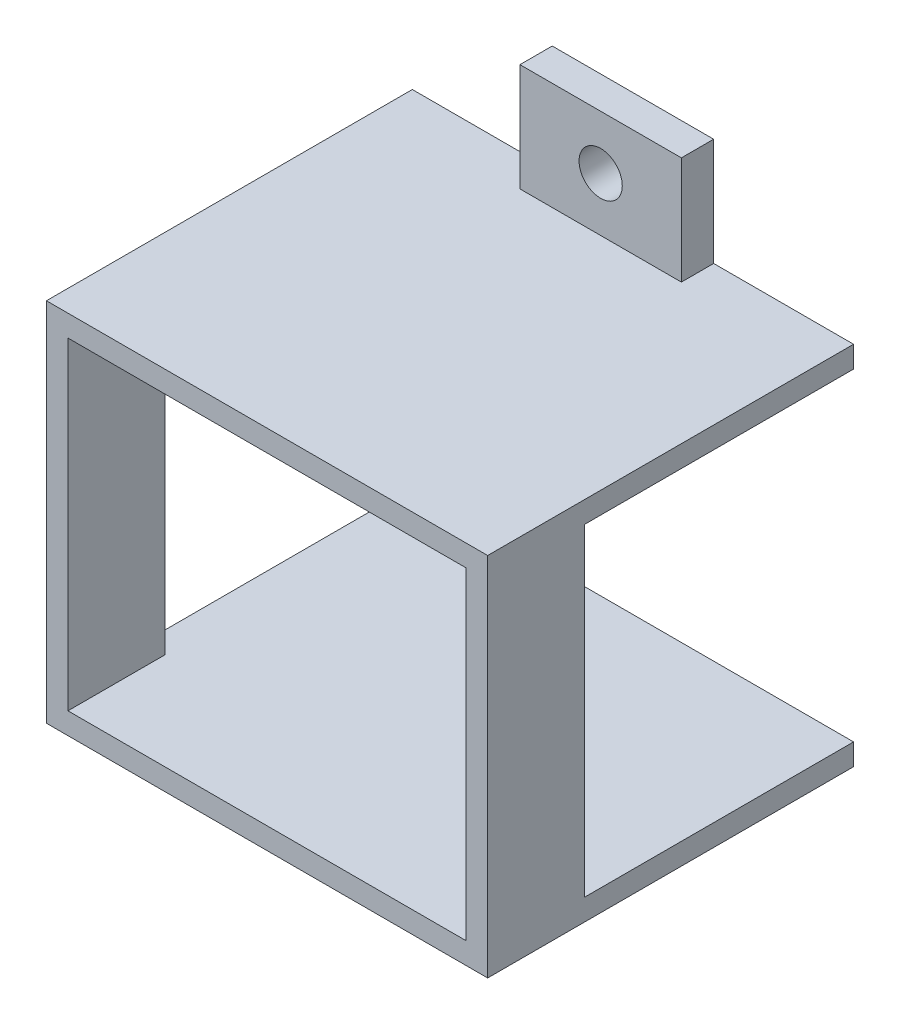
ISO-10303-21;
HEADER;
FILE_DESCRIPTION(('STEP AP214'),'2;1');
FILE_NAME('part.step','',(''),(''),'','','');
FILE_SCHEMA(('AUTOMOTIVE_DESIGN { 1 0 10303 214 1 1 1 1 }'));
ENDSEC;
DATA;
#1=APPLICATION_CONTEXT('core data for automotive mechanical design processes');
#2=APPLICATION_PROTOCOL_DEFINITION('international standard','automotive_design',2000,#1);
#3=PRODUCT_CONTEXT('',#1,'mechanical');
#4=PRODUCT('Part','Part','',(#3));
#5=PRODUCT_RELATED_PRODUCT_CATEGORY('part','',(#4));
#6=PRODUCT_DEFINITION_FORMATION('','',#4);
#7=PRODUCT_DEFINITION_CONTEXT('part definition',#1,'design');
#8=PRODUCT_DEFINITION('design','',#6,#7);
#9=PRODUCT_DEFINITION_SHAPE('','',#8);
#10=(LENGTH_UNIT() NAMED_UNIT(*) SI_UNIT(.MILLI.,.METRE.));
#11=(NAMED_UNIT(*) PLANE_ANGLE_UNIT() SI_UNIT($,.RADIAN.));
#12=(NAMED_UNIT(*) SI_UNIT($,.STERADIAN.) SOLID_ANGLE_UNIT());
#13=UNCERTAINTY_MEASURE_WITH_UNIT(LENGTH_MEASURE(1.E-05),#10,'distance_accuracy_value','');
#14=(GEOMETRIC_REPRESENTATION_CONTEXT(3) GLOBAL_UNCERTAINTY_ASSIGNED_CONTEXT((#13)) GLOBAL_UNIT_ASSIGNED_CONTEXT((#10,
#11,#12)) REPRESENTATION_CONTEXT('',''));
#15=CARTESIAN_POINT('',(0.,0.,0.));
#16=DIRECTION('',(0.,0.,1.));
#17=DIRECTION('',(1.,0.,0.));
#18=AXIS2_PLACEMENT_3D('',#15,#16,#17);
#19=CARTESIAN_POINT('',(0.,0.,0.));
#20=DIRECTION('',(0.,0.,1.));
#21=DIRECTION('',(1.,0.,0.));
#22=AXIS2_PLACEMENT_3D('',#19,#20,#21);
#23=PLANE('',#22);
#24=CARTESIAN_POINT('',(0.,22.,0.));
#25=DIRECTION('',(0.,0.,1.));
#26=DIRECTION('',(1.,0.,0.));
#27=AXIS2_PLACEMENT_3D('',#24,#25,#26);
#28=CIRCLE('',#27,2.00806305532725);
#29=CARTESIAN_POINT('',(2.00806305532725,22.,0.));
#30=VERTEX_POINT('',#29);
#31=EDGE_CURVE('E288',#30,#30,#28,.T.);
#32=ORIENTED_EDGE('',*,*,#31,.T.);
#33=EDGE_LOOP('',(#32));
#34=FACE_BOUND('',#33,.T.);
#35=DIRECTION('',(0.,1.,0.));
#36=VECTOR('',#35,1.);
#37=CARTESIAN_POINT('',(20.5,17.,0.));
#38=LINE('',#37,#36);
#39=CARTESIAN_POINT('',(20.5,15.,0.));
#40=VERTEX_POINT('',#39);
#41=CARTESIAN_POINT('',(20.5,17.,0.));
#42=VERTEX_POINT('',#41);
#43=EDGE_CURVE('E227',#40,#42,#38,.T.);
#44=ORIENTED_EDGE('',*,*,#43,.F.);
#45=DIRECTION('',(-1.,0.,0.));
#46=VECTOR('',#45,1.);
#47=CARTESIAN_POINT('',(-18.5,15.,0.));
#48=LINE('',#47,#46);
#49=CARTESIAN_POINT('',(-20.5,15.,0.));
#50=VERTEX_POINT('',#49);
#51=EDGE_CURVE('E183',#40,#50,#48,.T.);
#52=ORIENTED_EDGE('',*,*,#51,.T.);
#53=DIRECTION('',(0.,-1.,0.));
#54=VECTOR('',#53,1.);
#55=CARTESIAN_POINT('',(-20.5,17.,0.));
#56=LINE('',#55,#54);
#57=CARTESIAN_POINT('',(-20.5,17.,0.));
#58=VERTEX_POINT('',#57);
#59=EDGE_CURVE('E199',#58,#50,#56,.T.);
#60=ORIENTED_EDGE('',*,*,#59,.F.);
#61=DIRECTION('',(-1.,0.,0.));
#62=VECTOR('',#61,1.);
#63=CARTESIAN_POINT('',(-20.5,17.,0.));
#64=LINE('',#63,#62);
#65=CARTESIAN_POINT('',(-7.5,17.,0.));
#66=VERTEX_POINT('',#65);
#67=EDGE_CURVE('E203',#66,#58,#64,.T.);
#68=ORIENTED_EDGE('',*,*,#67,.F.);
#69=DIRECTION('',(0.,-1.,0.));
#70=VECTOR('',#69,1.);
#71=CARTESIAN_POINT('',(-7.5,27.,0.));
#72=LINE('',#71,#70);
#73=CARTESIAN_POINT('',(-7.5,27.,0.));
#74=VERTEX_POINT('',#73);
#75=EDGE_CURVE('E302',#74,#66,#72,.T.);
#76=ORIENTED_EDGE('',*,*,#75,.F.);
#77=DIRECTION('',(-1.,0.,0.));
#78=VECTOR('',#77,1.);
#79=CARTESIAN_POINT('',(-7.5,27.,0.));
#80=LINE('',#79,#78);
#81=CARTESIAN_POINT('',(7.5,27.,0.));
#82=VERTEX_POINT('',#81);
#83=EDGE_CURVE('E300',#82,#74,#80,.T.);
#84=ORIENTED_EDGE('',*,*,#83,.F.);
#85=DIRECTION('',(0.,-1.,0.));
#86=VECTOR('',#85,1.);
#87=CARTESIAN_POINT('',(7.5,27.,0.));
#88=LINE('',#87,#86);
#89=CARTESIAN_POINT('',(7.5,17.,0.));
#90=VERTEX_POINT('',#89);
#91=EDGE_CURVE('E311',#82,#90,#88,.T.);
#92=ORIENTED_EDGE('',*,*,#91,.T.);
#93=EDGE_CURVE('E200',#42,#90,#64,.T.);
#94=ORIENTED_EDGE('',*,*,#93,.F.);
#95=EDGE_LOOP('',(#44,#52,#60,#68,#76,#84,#92,#94));
#96=FACE_BOUND('',#95,.T.);
#97=ADVANCED_FACE('F33',(#34,#96),#23,.F.);
#98=CARTESIAN_POINT('',(-20.5,17.,34.));
#99=DIRECTION('',(0.,-1.,0.));
#100=DIRECTION('',(0.,0.,-1.));
#101=AXIS2_PLACEMENT_3D('',#98,#99,#100);
#102=PLANE('',#101);
#103=DIRECTION('',(0.,0.,1.));
#104=VECTOR('',#103,1.);
#105=CARTESIAN_POINT('',(-7.5,17.,0.));
#106=LINE('',#105,#104);
#107=CARTESIAN_POINT('',(-7.5,17.,3.));
#108=VERTEX_POINT('',#107);
#109=EDGE_CURVE('E291',#66,#108,#106,.T.);
#110=ORIENTED_EDGE('',*,*,#109,.F.);
#111=ORIENTED_EDGE('',*,*,#67,.T.);
#112=DIRECTION('',(0.,0.,-1.));
#113=VECTOR('',#112,1.);
#114=CARTESIAN_POINT('',(-20.5,17.,34.));
#115=LINE('',#114,#113);
#116=CARTESIAN_POINT('',(-20.5,17.,34.));
#117=VERTEX_POINT('',#116);
#118=EDGE_CURVE('E41',#117,#58,#115,.T.);
#119=ORIENTED_EDGE('',*,*,#118,.F.);
#120=DIRECTION('',(-1.,0.,0.));
#121=VECTOR('',#120,1.);
#122=CARTESIAN_POINT('',(-20.5,17.,34.));
#123=LINE('',#122,#121);
#124=CARTESIAN_POINT('',(20.5,17.,34.));
#125=VERTEX_POINT('',#124);
#126=EDGE_CURVE('E339',#125,#117,#123,.T.);
#127=ORIENTED_EDGE('',*,*,#126,.F.);
#128=DIRECTION('',(0.,0.,-1.));
#129=VECTOR('',#128,1.);
#130=CARTESIAN_POINT('',(20.5,17.,34.));
#131=LINE('',#130,#129);
#132=EDGE_CURVE('E11',#125,#42,#131,.T.);
#133=ORIENTED_EDGE('',*,*,#132,.T.);
#134=ORIENTED_EDGE('',*,*,#93,.T.);
#135=DIRECTION('',(0.,0.,-1.));
#136=VECTOR('',#135,1.);
#137=CARTESIAN_POINT('',(7.5,17.,0.));
#138=LINE('',#137,#136);
#139=CARTESIAN_POINT('',(7.5,17.,3.));
#140=VERTEX_POINT('',#139);
#141=EDGE_CURVE('E296',#140,#90,#138,.T.);
#142=ORIENTED_EDGE('',*,*,#141,.F.);
#143=DIRECTION('',(1.,0.,0.));
#144=VECTOR('',#143,1.);
#145=CARTESIAN_POINT('',(-7.5,17.,3.));
#146=LINE('',#145,#144);
#147=EDGE_CURVE('E305',#108,#140,#146,.T.);
#148=ORIENTED_EDGE('',*,*,#147,.F.);
#149=EDGE_LOOP('',(#110,#111,#119,#127,#133,#134,#142,#148));
#150=FACE_BOUND('',#149,.T.);
#151=ADVANCED_FACE('F348',(#150),#102,.F.);
#152=CARTESIAN_POINT('',(0.,0.,34.));
#153=DIRECTION('',(0.,0.,1.));
#154=DIRECTION('',(1.,0.,0.));
#155=AXIS2_PLACEMENT_3D('',#152,#153,#154);
#156=PLANE('',#155);
#157=DIRECTION('',(0.,1.,0.));
#158=VECTOR('',#157,1.);
#159=CARTESIAN_POINT('',(20.5,17.,34.));
#160=LINE('',#159,#158);
#161=CARTESIAN_POINT('',(20.5,-17.,34.));
#162=VERTEX_POINT('',#161);
#163=EDGE_CURVE('E208',#162,#125,#160,.T.);
#164=ORIENTED_EDGE('',*,*,#163,.T.);
#165=ORIENTED_EDGE('',*,*,#126,.T.);
#166=DIRECTION('',(0.,-1.,0.));
#167=VECTOR('',#166,1.);
#168=CARTESIAN_POINT('',(-20.5,17.,34.));
#169=LINE('',#168,#167);
#170=CARTESIAN_POINT('',(-20.5,-17.,34.));
#171=VERTEX_POINT('',#170);
#172=EDGE_CURVE('E218',#117,#171,#169,.T.);
#173=ORIENTED_EDGE('',*,*,#172,.T.);
#174=DIRECTION('',(1.,0.,0.));
#175=VECTOR('',#174,1.);
#176=CARTESIAN_POINT('',(-20.5,-17.,34.));
#177=LINE('',#176,#175);
#178=EDGE_CURVE('E213',#171,#162,#177,.T.);
#179=ORIENTED_EDGE('',*,*,#178,.T.);
#180=EDGE_LOOP('',(#164,#165,#173,#179));
#181=FACE_BOUND('',#180,.T.);
#182=DIRECTION('',(-1.,0.,0.));
#183=VECTOR('',#182,1.);
#184=CARTESIAN_POINT('',(-18.5,15.,34.));
#185=LINE('',#184,#183);
#186=CARTESIAN_POINT('',(18.5,15.,34.));
#187=VERTEX_POINT('',#186);
#188=CARTESIAN_POINT('',(-18.5,15.,34.));
#189=VERTEX_POINT('',#188);
#190=EDGE_CURVE('E320',#187,#189,#185,.T.);
#191=ORIENTED_EDGE('',*,*,#190,.F.);
#192=DIRECTION('',(0.,1.,0.));
#193=VECTOR('',#192,1.);
#194=CARTESIAN_POINT('',(18.5,15.,34.));
#195=LINE('',#194,#193);
#196=CARTESIAN_POINT('',(18.5,-15.,34.));
#197=VERTEX_POINT('',#196);
#198=EDGE_CURVE('E182',#197,#187,#195,.T.);
#199=ORIENTED_EDGE('',*,*,#198,.F.);
#200=DIRECTION('',(1.,0.,0.));
#201=VECTOR('',#200,1.);
#202=CARTESIAN_POINT('',(-18.5,-15.,34.));
#203=LINE('',#202,#201);
#204=CARTESIAN_POINT('',(-18.5,-15.,34.));
#205=VERTEX_POINT('',#204);
#206=EDGE_CURVE('E325',#205,#197,#203,.T.);
#207=ORIENTED_EDGE('',*,*,#206,.F.);
#208=DIRECTION('',(0.,-1.,0.));
#209=VECTOR('',#208,1.);
#210=CARTESIAN_POINT('',(-18.5,15.,34.));
#211=LINE('',#210,#209);
#212=EDGE_CURVE('E322',#189,#205,#211,.T.);
#213=ORIENTED_EDGE('',*,*,#212,.F.);
#214=EDGE_LOOP('',(#191,#199,#207,#213));
#215=FACE_BOUND('',#214,.T.);
#216=ADVANCED_FACE('F350',(#181,#215),#156,.T.);
#217=CARTESIAN_POINT('',(0.,-22.,0.));
#218=DIRECTION('',(0.,0.,1.));
#219=DIRECTION('',(1.,0.,0.));
#220=AXIS2_PLACEMENT_3D('',#217,#218,#219);
#221=CIRCLE('',#220,2.00806305532725);
#222=CARTESIAN_POINT('',(2.00806305532725,-22.,0.));
#223=VERTEX_POINT('',#222);
#224=EDGE_CURVE('E256',#223,#223,#221,.F.);
#225=ORIENTED_EDGE('',*,*,#224,.F.);
#226=EDGE_LOOP('',(#225));
#227=FACE_BOUND('',#226,.T.);
#228=CARTESIAN_POINT('',(-20.5,-15.,0.));
#229=VERTEX_POINT('',#228);
#230=CARTESIAN_POINT('',(-20.5,-17.,0.));
#231=VERTEX_POINT('',#230);
#232=EDGE_CURVE('E189',#229,#231,#56,.T.);
#233=ORIENTED_EDGE('',*,*,#232,.F.);
#234=DIRECTION('',(1.,0.,0.));
#235=VECTOR('',#234,1.);
#236=CARTESIAN_POINT('',(-18.5,-15.,0.));
#237=LINE('',#236,#235);
#238=CARTESIAN_POINT('',(20.5,-15.,0.));
#239=VERTEX_POINT('',#238);
#240=EDGE_CURVE('E169',#229,#239,#237,.T.);
#241=ORIENTED_EDGE('',*,*,#240,.T.);
#242=CARTESIAN_POINT('',(20.5,-17.,0.));
#243=VERTEX_POINT('',#242);
#244=EDGE_CURVE('E342',#243,#239,#38,.T.);
#245=ORIENTED_EDGE('',*,*,#244,.F.);
#246=DIRECTION('',(1.,0.,0.));
#247=VECTOR('',#246,1.);
#248=CARTESIAN_POINT('',(-20.5,-17.,0.));
#249=LINE('',#248,#247);
#250=CARTESIAN_POINT('',(7.5,-17.,0.));
#251=VERTEX_POINT('',#250);
#252=EDGE_CURVE('E202',#251,#243,#249,.T.);
#253=ORIENTED_EDGE('',*,*,#252,.F.);
#254=DIRECTION('',(0.,1.,0.));
#255=VECTOR('',#254,1.);
#256=CARTESIAN_POINT('',(7.5,-27.,0.));
#257=LINE('',#256,#255);
#258=CARTESIAN_POINT('',(7.5,-27.,0.));
#259=VERTEX_POINT('',#258);
#260=EDGE_CURVE('E56',#259,#251,#257,.T.);
#261=ORIENTED_EDGE('',*,*,#260,.F.);
#262=DIRECTION('',(-1.,0.,0.));
#263=VECTOR('',#262,1.);
#264=CARTESIAN_POINT('',(-7.5,-27.,0.));
#265=LINE('',#264,#263);
#266=CARTESIAN_POINT('',(-7.5,-27.,0.));
#267=VERTEX_POINT('',#266);
#268=EDGE_CURVE('E263',#259,#267,#265,.T.);
#269=ORIENTED_EDGE('',*,*,#268,.T.);
#270=DIRECTION('',(0.,1.,0.));
#271=VECTOR('',#270,1.);
#272=CARTESIAN_POINT('',(-7.5,-27.,0.));
#273=LINE('',#272,#271);
#274=CARTESIAN_POINT('',(-7.5,-17.,0.));
#275=VERTEX_POINT('',#274);
#276=EDGE_CURVE('E283',#267,#275,#273,.T.);
#277=ORIENTED_EDGE('',*,*,#276,.T.);
#278=EDGE_CURVE('E198',#231,#275,#249,.T.);
#279=ORIENTED_EDGE('',*,*,#278,.F.);
#280=EDGE_LOOP('',(#233,#241,#245,#253,#261,#269,#277,#279));
#281=FACE_BOUND('',#280,.T.);
#282=ADVANCED_FACE('F196',(#227,#281),#23,.F.);
#283=CARTESIAN_POINT('',(20.5,17.,34.));
#284=DIRECTION('',(-1.,0.,0.));
#285=DIRECTION('',(0.,0.,1.));
#286=AXIS2_PLACEMENT_3D('',#283,#284,#285);
#287=PLANE('',#286);
#288=DIRECTION('',(0.,1.,0.));
#289=VECTOR('',#288,1.);
#290=CARTESIAN_POINT('',(20.5,17.,25.));
#291=LINE('',#290,#289);
#292=CARTESIAN_POINT('',(20.5,-15.,25.));
#293=VERTEX_POINT('',#292);
#294=CARTESIAN_POINT('',(20.5,15.,25.));
#295=VERTEX_POINT('',#294);
#296=EDGE_CURVE('E247',#293,#295,#291,.T.);
#297=ORIENTED_EDGE('',*,*,#296,.T.);
#298=DIRECTION('',(0.,0.,-1.));
#299=VECTOR('',#298,1.);
#300=CARTESIAN_POINT('',(20.5,15.,34.));
#301=LINE('',#300,#299);
#302=EDGE_CURVE('E251',#295,#40,#301,.T.);
#303=ORIENTED_EDGE('',*,*,#302,.T.);
#304=ORIENTED_EDGE('',*,*,#43,.T.);
#305=ORIENTED_EDGE('',*,*,#132,.F.);
#306=ORIENTED_EDGE('',*,*,#163,.F.);
#307=DIRECTION('',(0.,0.,-1.));
#308=VECTOR('',#307,1.);
#309=CARTESIAN_POINT('',(20.5,-17.,34.));
#310=LINE('',#309,#308);
#311=EDGE_CURVE('E209',#162,#243,#310,.T.);
#312=ORIENTED_EDGE('',*,*,#311,.T.);
#313=ORIENTED_EDGE('',*,*,#244,.T.);
#314=DIRECTION('',(0.,0.,1.));
#315=VECTOR('',#314,1.);
#316=CARTESIAN_POINT('',(20.5,-15.,34.));
#317=LINE('',#316,#315);
#318=EDGE_CURVE('E177',#239,#293,#317,.T.);
#319=ORIENTED_EDGE('',*,*,#318,.T.);
#320=EDGE_LOOP('',(#297,#303,#304,#305,#306,#312,#313,#319));
#321=FACE_BOUND('',#320,.T.);
#322=ADVANCED_FACE('F35',(#321),#287,.F.);
#323=CARTESIAN_POINT('',(-20.5,17.,34.));
#324=DIRECTION('',(1.,0.,0.));
#325=DIRECTION('',(0.,1.,0.));
#326=AXIS2_PLACEMENT_3D('',#323,#324,#325);
#327=PLANE('',#326);
#328=ORIENTED_EDGE('',*,*,#59,.T.);
#329=DIRECTION('',(0.,0.,-1.));
#330=VECTOR('',#329,1.);
#331=CARTESIAN_POINT('',(-20.5,15.,0.));
#332=LINE('',#331,#330);
#333=CARTESIAN_POINT('',(-20.5,15.,25.));
#334=VERTEX_POINT('',#333);
#335=EDGE_CURVE('E232',#334,#50,#332,.T.);
#336=ORIENTED_EDGE('',*,*,#335,.F.);
#337=DIRECTION('',(0.,1.,0.));
#338=VECTOR('',#337,1.);
#339=CARTESIAN_POINT('',(-20.5,-15.,25.));
#340=LINE('',#339,#338);
#341=CARTESIAN_POINT('',(-20.5,-15.,25.));
#342=VERTEX_POINT('',#341);
#343=EDGE_CURVE('E193',#342,#334,#340,.T.);
#344=ORIENTED_EDGE('',*,*,#343,.F.);
#345=DIRECTION('',(0.,0.,1.));
#346=VECTOR('',#345,1.);
#347=CARTESIAN_POINT('',(-20.5,-15.,0.));
#348=LINE('',#347,#346);
#349=EDGE_CURVE('E173',#229,#342,#348,.T.);
#350=ORIENTED_EDGE('',*,*,#349,.F.);
#351=ORIENTED_EDGE('',*,*,#232,.T.);
#352=DIRECTION('',(0.,0.,-1.));
#353=VECTOR('',#352,1.);
#354=CARTESIAN_POINT('',(-20.5,-17.,34.));
#355=LINE('',#354,#353);
#356=EDGE_CURVE('E212',#171,#231,#355,.T.);
#357=ORIENTED_EDGE('',*,*,#356,.F.);
#358=ORIENTED_EDGE('',*,*,#172,.F.);
#359=ORIENTED_EDGE('',*,*,#118,.T.);
#360=EDGE_LOOP('',(#328,#336,#344,#350,#351,#357,#358,#359));
#361=FACE_BOUND('',#360,.T.);
#362=ADVANCED_FACE('F187',(#361),#327,.F.);
#363=CARTESIAN_POINT('',(-20.5,-17.,34.));
#364=DIRECTION('',(0.,1.,0.));
#365=DIRECTION('',(0.,0.,1.));
#366=AXIS2_PLACEMENT_3D('',#363,#364,#365);
#367=PLANE('',#366);
#368=ORIENTED_EDGE('',*,*,#278,.T.);
#369=DIRECTION('',(0.,0.,1.));
#370=VECTOR('',#369,1.);
#371=CARTESIAN_POINT('',(-7.5,-17.,0.));
#372=LINE('',#371,#370);
#373=CARTESIAN_POINT('',(-7.5,-17.,3.));
#374=VERTEX_POINT('',#373);
#375=EDGE_CURVE('E259',#275,#374,#372,.T.);
#376=ORIENTED_EDGE('',*,*,#375,.T.);
#377=DIRECTION('',(1.,0.,0.));
#378=VECTOR('',#377,1.);
#379=CARTESIAN_POINT('',(-7.5,-17.,3.));
#380=LINE('',#379,#378);
#381=CARTESIAN_POINT('',(7.5,-17.,3.));
#382=VERTEX_POINT('',#381);
#383=EDGE_CURVE('E264',#374,#382,#380,.T.);
#384=ORIENTED_EDGE('',*,*,#383,.T.);
#385=DIRECTION('',(0.,0.,-1.));
#386=VECTOR('',#385,1.);
#387=CARTESIAN_POINT('',(7.5,-17.,0.));
#388=LINE('',#387,#386);
#389=EDGE_CURVE('E275',#382,#251,#388,.T.);
#390=ORIENTED_EDGE('',*,*,#389,.T.);
#391=ORIENTED_EDGE('',*,*,#252,.T.);
#392=ORIENTED_EDGE('',*,*,#311,.F.);
#393=ORIENTED_EDGE('',*,*,#178,.F.);
#394=ORIENTED_EDGE('',*,*,#356,.T.);
#395=EDGE_LOOP('',(#368,#376,#384,#390,#391,#392,#393,#394));
#396=FACE_BOUND('',#395,.T.);
#397=ADVANCED_FACE('F357',(#396),#367,.F.);
#398=CARTESIAN_POINT('',(18.5,15.,34.));
#399=DIRECTION('',(-1.,0.,0.));
#400=DIRECTION('',(0.,-1.,0.));
#401=AXIS2_PLACEMENT_3D('',#398,#399,#400);
#402=PLANE('',#401);
#403=DIRECTION('',(0.,1.,0.));
#404=VECTOR('',#403,1.);
#405=CARTESIAN_POINT('',(18.5,15.,25.));
#406=LINE('',#405,#404);
#407=CARTESIAN_POINT('',(18.5,-15.,25.));
#408=VERTEX_POINT('',#407);
#409=CARTESIAN_POINT('',(18.5,15.,25.));
#410=VERTEX_POINT('',#409);
#411=EDGE_CURVE('E245',#408,#410,#406,.T.);
#412=ORIENTED_EDGE('',*,*,#411,.F.);
#413=DIRECTION('',(0.,0.,-1.));
#414=VECTOR('',#413,1.);
#415=CARTESIAN_POINT('',(18.5,-15.,34.));
#416=LINE('',#415,#414);
#417=EDGE_CURVE('E326',#197,#408,#416,.T.);
#418=ORIENTED_EDGE('',*,*,#417,.F.);
#419=ORIENTED_EDGE('',*,*,#198,.T.);
#420=DIRECTION('',(0.,0.,-1.));
#421=VECTOR('',#420,1.);
#422=CARTESIAN_POINT('',(18.5,15.,34.));
#423=LINE('',#422,#421);
#424=EDGE_CURVE('E334',#187,#410,#423,.T.);
#425=ORIENTED_EDGE('',*,*,#424,.T.);
#426=EDGE_LOOP('',(#412,#418,#419,#425));
#427=FACE_BOUND('',#426,.T.);
#428=ADVANCED_FACE('F462',(#427),#402,.T.);
#429=CARTESIAN_POINT('',(-18.5,15.,34.));
#430=DIRECTION('',(0.,-1.,0.));
#431=DIRECTION('',(0.,0.,-1.));
#432=AXIS2_PLACEMENT_3D('',#429,#430,#431);
#433=PLANE('',#432);
#434=DIRECTION('',(0.,0.,-1.));
#435=VECTOR('',#434,1.);
#436=CARTESIAN_POINT('',(-18.5,15.,34.));
#437=LINE('',#436,#435);
#438=CARTESIAN_POINT('',(-18.5,15.,25.));
#439=VERTEX_POINT('',#438);
#440=EDGE_CURVE('E332',#189,#439,#437,.T.);
#441=ORIENTED_EDGE('',*,*,#440,.T.);
#442=DIRECTION('',(-1.,0.,0.));
#443=VECTOR('',#442,1.);
#444=CARTESIAN_POINT('',(39.5,15.,25.));
#445=LINE('',#444,#443);
#446=EDGE_CURVE('E235',#439,#334,#445,.T.);
#447=ORIENTED_EDGE('',*,*,#446,.T.);
#448=ORIENTED_EDGE('',*,*,#335,.T.);
#449=ORIENTED_EDGE('',*,*,#51,.F.);
#450=ORIENTED_EDGE('',*,*,#302,.F.);
#451=EDGE_CURVE('E241',#295,#410,#445,.T.);
#452=ORIENTED_EDGE('',*,*,#451,.T.);
#453=ORIENTED_EDGE('',*,*,#424,.F.);
#454=ORIENTED_EDGE('',*,*,#190,.T.);
#455=EDGE_LOOP('',(#441,#447,#448,#449,#450,#452,#453,#454));
#456=FACE_BOUND('',#455,.T.);
#457=ADVANCED_FACE('F234',(#456),#433,.T.);
#458=CARTESIAN_POINT('',(-18.5,15.,34.));
#459=DIRECTION('',(1.,0.,0.));
#460=DIRECTION('',(0.,1.,0.));
#461=AXIS2_PLACEMENT_3D('',#458,#459,#460);
#462=PLANE('',#461);
#463=DIRECTION('',(0.,-1.,0.));
#464=VECTOR('',#463,1.);
#465=CARTESIAN_POINT('',(-18.5,15.,25.));
#466=LINE('',#465,#464);
#467=CARTESIAN_POINT('',(-18.5,-15.,25.));
#468=VERTEX_POINT('',#467);
#469=EDGE_CURVE('E243',#439,#468,#466,.T.);
#470=ORIENTED_EDGE('',*,*,#469,.F.);
#471=ORIENTED_EDGE('',*,*,#440,.F.);
#472=ORIENTED_EDGE('',*,*,#212,.T.);
#473=DIRECTION('',(0.,0.,-1.));
#474=VECTOR('',#473,1.);
#475=CARTESIAN_POINT('',(-18.5,-15.,34.));
#476=LINE('',#475,#474);
#477=EDGE_CURVE('E329',#205,#468,#476,.T.);
#478=ORIENTED_EDGE('',*,*,#477,.T.);
#479=EDGE_LOOP('',(#470,#471,#472,#478));
#480=FACE_BOUND('',#479,.T.);
#481=ADVANCED_FACE('F476',(#480),#462,.T.);
#482=CARTESIAN_POINT('',(-18.5,-15.,34.));
#483=DIRECTION('',(0.,1.,0.));
#484=DIRECTION('',(0.,0.,1.));
#485=AXIS2_PLACEMENT_3D('',#482,#483,#484);
#486=PLANE('',#485);
#487=ORIENTED_EDGE('',*,*,#417,.T.);
#488=DIRECTION('',(-1.,0.,0.));
#489=VECTOR('',#488,1.);
#490=CARTESIAN_POINT('',(39.5,-15.,25.));
#491=LINE('',#490,#489);
#492=EDGE_CURVE('E237',#293,#408,#491,.T.);
#493=ORIENTED_EDGE('',*,*,#492,.F.);
#494=ORIENTED_EDGE('',*,*,#318,.F.);
#495=ORIENTED_EDGE('',*,*,#240,.F.);
#496=ORIENTED_EDGE('',*,*,#349,.T.);
#497=EDGE_CURVE('E48',#468,#342,#491,.T.);
#498=ORIENTED_EDGE('',*,*,#497,.F.);
#499=ORIENTED_EDGE('',*,*,#477,.F.);
#500=ORIENTED_EDGE('',*,*,#206,.T.);
#501=EDGE_LOOP('',(#487,#493,#494,#495,#496,#498,#499,#500));
#502=FACE_BOUND('',#501,.T.);
#503=ADVANCED_FACE('F172',(#502),#486,.T.);
#504=CARTESIAN_POINT('',(-7.5,27.,0.));
#505=DIRECTION('',(1.,0.,0.));
#506=DIRECTION('',(0.,0.,-1.));
#507=AXIS2_PLACEMENT_3D('',#504,#505,#506);
#508=PLANE('',#507);
#509=ORIENTED_EDGE('',*,*,#109,.T.);
#510=DIRECTION('',(0.,-1.,0.));
#511=VECTOR('',#510,1.);
#512=CARTESIAN_POINT('',(-7.5,27.,3.));
#513=LINE('',#512,#511);
#514=CARTESIAN_POINT('',(-7.5,27.,3.));
#515=VERTEX_POINT('',#514);
#516=EDGE_CURVE('E230',#515,#108,#513,.T.);
#517=ORIENTED_EDGE('',*,*,#516,.F.);
#518=DIRECTION('',(0.,0.,1.));
#519=VECTOR('',#518,1.);
#520=CARTESIAN_POINT('',(-7.5,27.,0.));
#521=LINE('',#520,#519);
#522=EDGE_CURVE('E292',#74,#515,#521,.T.);
#523=ORIENTED_EDGE('',*,*,#522,.F.);
#524=ORIENTED_EDGE('',*,*,#75,.T.);
#525=EDGE_LOOP('',(#509,#517,#523,#524));
#526=FACE_BOUND('',#525,.T.);
#527=ADVANCED_FACE('F495',(#526),#508,.F.);
#528=CARTESIAN_POINT('',(-7.5,27.,3.));
#529=DIRECTION('',(0.,0.,-1.));
#530=DIRECTION('',(-1.,0.,0.));
#531=AXIS2_PLACEMENT_3D('',#528,#529,#530);
#532=PLANE('',#531);
#533=CARTESIAN_POINT('',(0.,22.,3.));
#534=DIRECTION('',(0.,0.,1.));
#535=DIRECTION('',(1.,0.,0.));
#536=AXIS2_PLACEMENT_3D('',#533,#534,#535);
#537=CIRCLE('',#536,2.00806305532725);
#538=CARTESIAN_POINT('',(2.00806305532725,22.,3.));
#539=VERTEX_POINT('',#538);
#540=EDGE_CURVE('E285',#539,#539,#537,.T.);
#541=ORIENTED_EDGE('',*,*,#540,.F.);
#542=EDGE_LOOP('',(#541));
#543=FACE_BOUND('',#542,.T.);
#544=ORIENTED_EDGE('',*,*,#147,.T.);
#545=DIRECTION('',(0.,-1.,0.));
#546=VECTOR('',#545,1.);
#547=CARTESIAN_POINT('',(7.5,27.,3.));
#548=LINE('',#547,#546);
#549=CARTESIAN_POINT('',(7.5,27.,3.));
#550=VERTEX_POINT('',#549);
#551=EDGE_CURVE('E314',#550,#140,#548,.T.);
#552=ORIENTED_EDGE('',*,*,#551,.F.);
#553=DIRECTION('',(1.,0.,0.));
#554=VECTOR('',#553,1.);
#555=CARTESIAN_POINT('',(-7.5,27.,3.));
#556=LINE('',#555,#554);
#557=EDGE_CURVE('E295',#515,#550,#556,.T.);
#558=ORIENTED_EDGE('',*,*,#557,.F.);
#559=ORIENTED_EDGE('',*,*,#516,.T.);
#560=EDGE_LOOP('',(#544,#552,#558,#559));
#561=FACE_BOUND('',#560,.T.);
#562=ADVANCED_FACE('F528',(#543,#561),#532,.F.);
#563=CARTESIAN_POINT('',(7.5,27.,0.));
#564=DIRECTION('',(-1.,0.,0.));
#565=DIRECTION('',(0.,0.,1.));
#566=AXIS2_PLACEMENT_3D('',#563,#564,#565);
#567=PLANE('',#566);
#568=ORIENTED_EDGE('',*,*,#141,.T.);
#569=ORIENTED_EDGE('',*,*,#91,.F.);
#570=DIRECTION('',(0.,0.,-1.));
#571=VECTOR('',#570,1.);
#572=CARTESIAN_POINT('',(7.5,27.,0.));
#573=LINE('',#572,#571);
#574=EDGE_CURVE('E298',#550,#82,#573,.T.);
#575=ORIENTED_EDGE('',*,*,#574,.F.);
#576=ORIENTED_EDGE('',*,*,#551,.T.);
#577=EDGE_LOOP('',(#568,#569,#575,#576));
#578=FACE_BOUND('',#577,.T.);
#579=ADVANCED_FACE('F538',(#578),#567,.F.);
#580=CARTESIAN_POINT('',(0.,27.,0.));
#581=DIRECTION('',(0.,1.,0.));
#582=DIRECTION('',(0.,0.,1.));
#583=AXIS2_PLACEMENT_3D('',#580,#581,#582);
#584=PLANE('',#583);
#585=ORIENTED_EDGE('',*,*,#522,.T.);
#586=ORIENTED_EDGE('',*,*,#557,.T.);
#587=ORIENTED_EDGE('',*,*,#574,.T.);
#588=ORIENTED_EDGE('',*,*,#83,.T.);
#589=EDGE_LOOP('',(#585,#586,#587,#588));
#590=FACE_BOUND('',#589,.T.);
#591=ADVANCED_FACE('F378',(#590),#584,.T.);
#592=CARTESIAN_POINT('',(0.,22.,-7.));
#593=DIRECTION('',(0.,0.,1.));
#594=DIRECTION('',(1.,0.,0.));
#595=AXIS2_PLACEMENT_3D('',#592,#593,#594);
#596=CYLINDRICAL_SURFACE('',#595,2.00806305532725);
#597=ORIENTED_EDGE('',*,*,#540,.T.);
#598=EDGE_LOOP('',(#597));
#599=FACE_BOUND('',#598,.T.);
#600=ORIENTED_EDGE('',*,*,#31,.F.);
#601=EDGE_LOOP('',(#600));
#602=FACE_BOUND('',#601,.T.);
#603=ADVANCED_FACE('F371',(#599,#602),#596,.F.);
#604=CARTESIAN_POINT('',(-7.5,-27.,0.));
#605=DIRECTION('',(-1.,0.,0.));
#606=DIRECTION('',(0.,0.,1.));
#607=AXIS2_PLACEMENT_3D('',#604,#605,#606);
#608=PLANE('',#607);
#609=ORIENTED_EDGE('',*,*,#375,.F.);
#610=ORIENTED_EDGE('',*,*,#276,.F.);
#611=DIRECTION('',(0.,0.,1.));
#612=VECTOR('',#611,1.);
#613=CARTESIAN_POINT('',(-7.5,-27.,0.));
#614=LINE('',#613,#612);
#615=CARTESIAN_POINT('',(-7.5,-27.,3.));
#616=VERTEX_POINT('',#615);
#617=EDGE_CURVE('E260',#267,#616,#614,.T.);
#618=ORIENTED_EDGE('',*,*,#617,.T.);
#619=DIRECTION('',(0.,1.,0.));
#620=VECTOR('',#619,1.);
#621=CARTESIAN_POINT('',(-7.5,-27.,3.));
#622=LINE('',#621,#620);
#623=EDGE_CURVE('E272',#616,#374,#622,.T.);
#624=ORIENTED_EDGE('',*,*,#623,.T.);
#625=EDGE_LOOP('',(#609,#610,#618,#624));
#626=FACE_BOUND('',#625,.T.);
#627=ADVANCED_FACE('F369',(#626),#608,.T.);
#628=CARTESIAN_POINT('',(7.5,-27.,0.));
#629=DIRECTION('',(1.,0.,0.));
#630=DIRECTION('',(0.,0.,-1.));
#631=AXIS2_PLACEMENT_3D('',#628,#629,#630);
#632=PLANE('',#631);
#633=ORIENTED_EDGE('',*,*,#389,.F.);
#634=DIRECTION('',(0.,1.,0.));
#635=VECTOR('',#634,1.);
#636=CARTESIAN_POINT('',(7.5,-27.,3.));
#637=LINE('',#636,#635);
#638=CARTESIAN_POINT('',(7.5,-27.,3.));
#639=VERTEX_POINT('',#638);
#640=EDGE_CURVE('E280',#639,#382,#637,.T.);
#641=ORIENTED_EDGE('',*,*,#640,.F.);
#642=DIRECTION('',(0.,0.,-1.));
#643=VECTOR('',#642,1.);
#644=CARTESIAN_POINT('',(7.5,-27.,0.));
#645=LINE('',#644,#643);
#646=EDGE_CURVE('E267',#639,#259,#645,.T.);
#647=ORIENTED_EDGE('',*,*,#646,.T.);
#648=ORIENTED_EDGE('',*,*,#260,.T.);
#649=EDGE_LOOP('',(#633,#641,#647,#648));
#650=FACE_BOUND('',#649,.T.);
#651=ADVANCED_FACE('F359',(#650),#632,.T.);
#652=CARTESIAN_POINT('',(-7.5,-27.,3.));
#653=DIRECTION('',(0.,0.,1.));
#654=DIRECTION('',(1.,0.,0.));
#655=AXIS2_PLACEMENT_3D('',#652,#653,#654);
#656=PLANE('',#655);
#657=CARTESIAN_POINT('',(0.,-22.,3.));
#658=DIRECTION('',(0.,0.,-1.));
#659=DIRECTION('',(1.,0.,0.));
#660=AXIS2_PLACEMENT_3D('',#657,#658,#659);
#661=CIRCLE('',#660,2.00806305532725);
#662=CARTESIAN_POINT('',(2.00806305532725,-22.,3.));
#663=VERTEX_POINT('',#662);
#664=EDGE_CURVE('E253',#663,#663,#661,.T.);
#665=ORIENTED_EDGE('',*,*,#664,.T.);
#666=EDGE_LOOP('',(#665));
#667=FACE_BOUND('',#666,.T.);
#668=ORIENTED_EDGE('',*,*,#383,.F.);
#669=ORIENTED_EDGE('',*,*,#623,.F.);
#670=DIRECTION('',(1.,0.,0.));
#671=VECTOR('',#670,1.);
#672=CARTESIAN_POINT('',(-7.5,-27.,3.));
#673=LINE('',#672,#671);
#674=EDGE_CURVE('E269',#616,#639,#673,.T.);
#675=ORIENTED_EDGE('',*,*,#674,.T.);
#676=ORIENTED_EDGE('',*,*,#640,.T.);
#677=EDGE_LOOP('',(#668,#669,#675,#676));
#678=FACE_BOUND('',#677,.T.);
#679=ADVANCED_FACE('F366',(#667,#678),#656,.T.);
#680=CARTESIAN_POINT('',(0.,-27.,0.));
#681=DIRECTION('',(0.,-1.,0.));
#682=DIRECTION('',(0.,0.,1.));
#683=AXIS2_PLACEMENT_3D('',#680,#681,#682);
#684=PLANE('',#683);
#685=ORIENTED_EDGE('',*,*,#617,.F.);
#686=ORIENTED_EDGE('',*,*,#268,.F.);
#687=ORIENTED_EDGE('',*,*,#646,.F.);
#688=ORIENTED_EDGE('',*,*,#674,.F.);
#689=EDGE_LOOP('',(#685,#686,#687,#688));
#690=FACE_BOUND('',#689,.T.);
#691=ADVANCED_FACE('F365',(#690),#684,.T.);
#692=CARTESIAN_POINT('',(0.,-22.,-7.));
#693=DIRECTION('',(0.,0.,1.));
#694=DIRECTION('',(1.,0.,0.));
#695=AXIS2_PLACEMENT_3D('',#692,#693,#694);
#696=CYLINDRICAL_SURFACE('',#695,2.00806305532725);
#697=ORIENTED_EDGE('',*,*,#664,.F.);
#698=EDGE_LOOP('',(#697));
#699=FACE_BOUND('',#698,.T.);
#700=ORIENTED_EDGE('',*,*,#224,.T.);
#701=EDGE_LOOP('',(#700));
#702=FACE_BOUND('',#701,.T.);
#703=ADVANCED_FACE('F397',(#699,#702),#696,.F.);
#704=CARTESIAN_POINT('',(39.5,-15.,25.));
#705=DIRECTION('',(0.,0.,1.));
#706=DIRECTION('',(1.,0.,0.));
#707=AXIS2_PLACEMENT_3D('',#704,#705,#706);
#708=PLANE('',#707);
#709=ORIENTED_EDGE('',*,*,#469,.T.);
#710=ORIENTED_EDGE('',*,*,#497,.T.);
#711=ORIENTED_EDGE('',*,*,#343,.T.);
#712=ORIENTED_EDGE('',*,*,#446,.F.);
#713=EDGE_LOOP('',(#709,#710,#711,#712));
#714=FACE_BOUND('',#713,.T.);
#715=ADVANCED_FACE('F399',(#714),#708,.F.);
#716=ORIENTED_EDGE('',*,*,#492,.T.);
#717=ORIENTED_EDGE('',*,*,#411,.T.);
#718=ORIENTED_EDGE('',*,*,#451,.F.);
#719=ORIENTED_EDGE('',*,*,#296,.F.);
#720=EDGE_LOOP('',(#716,#717,#718,#719));
#721=FACE_BOUND('',#720,.T.);
#722=ADVANCED_FACE('F406',(#721),#708,.F.);
#723=CLOSED_SHELL('',(#97,#151,#216,#282,#322,#362,#397,#428,#457,#481,#503,#527,#562,#579,#591,
#603,#627,#651,#679,#691,#703,#715,#722));
#724=MANIFOLD_SOLID_BREP('B2',#723);
#725=ADVANCED_BREP_SHAPE_REPRESENTATION('',(#18,#724),#14);
#726=SHAPE_DEFINITION_REPRESENTATION(#9,#725);
ENDSEC;
END-ISO-10303-21;
